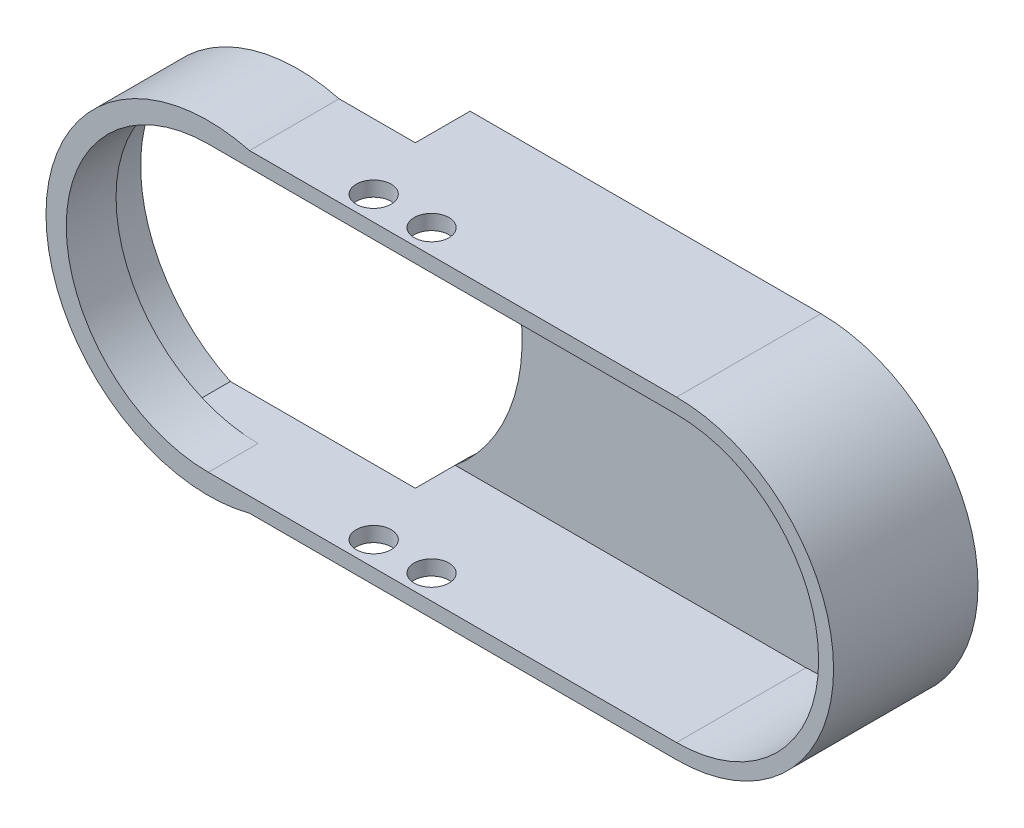
ISO-10303-21;
HEADER;
FILE_DESCRIPTION(('STEP AP214'),'2;1');
FILE_NAME('part.step','',(''),(''),'','','');
FILE_SCHEMA(('AUTOMOTIVE_DESIGN { 1 0 10303 214 1 1 1 1 }'));
ENDSEC;
DATA;
#1=APPLICATION_CONTEXT('core data for automotive mechanical design processes');
#2=APPLICATION_PROTOCOL_DEFINITION('international standard','automotive_design',2000,#1);
#3=PRODUCT_CONTEXT('',#1,'mechanical');
#4=PRODUCT('Part','Part','',(#3));
#5=PRODUCT_RELATED_PRODUCT_CATEGORY('part','',(#4));
#6=PRODUCT_DEFINITION_FORMATION('','',#4);
#7=PRODUCT_DEFINITION_CONTEXT('part definition',#1,'design');
#8=PRODUCT_DEFINITION('design','',#6,#7);
#9=PRODUCT_DEFINITION_SHAPE('','',#8);
#10=(LENGTH_UNIT() NAMED_UNIT(*) SI_UNIT(.MILLI.,.METRE.));
#11=(NAMED_UNIT(*) PLANE_ANGLE_UNIT() SI_UNIT($,.RADIAN.));
#12=(NAMED_UNIT(*) SI_UNIT($,.STERADIAN.) SOLID_ANGLE_UNIT());
#13=UNCERTAINTY_MEASURE_WITH_UNIT(LENGTH_MEASURE(1.E-05),#10,'distance_accuracy_value','');
#14=(GEOMETRIC_REPRESENTATION_CONTEXT(3) GLOBAL_UNCERTAINTY_ASSIGNED_CONTEXT((#13)) GLOBAL_UNIT_ASSIGNED_CONTEXT((#10,
#11,#12)) REPRESENTATION_CONTEXT('',''));
#15=CARTESIAN_POINT('',(0.,0.,0.));
#16=DIRECTION('',(0.,0.,1.));
#17=DIRECTION('',(1.,0.,0.));
#18=AXIS2_PLACEMENT_3D('',#15,#16,#17);
#19=CARTESIAN_POINT('',(-58.78,0.,19.));
#20=DIRECTION('',(0.,0.,-1.));
#21=DIRECTION('',(-1.,0.,0.));
#22=AXIS2_PLACEMENT_3D('',#19,#20,#21);
#23=PLANE('',#22);
#24=CARTESIAN_POINT('',(-58.78,0.,19.));
#25=DIRECTION('',(0.,0.,-1.));
#26=DIRECTION('',(-1.,0.,0.));
#27=AXIS2_PLACEMENT_3D('',#24,#25,#26);
#28=CIRCLE('',#27,28.535);
#29=CARTESIAN_POINT('',(-58.78,-28.535,19.));
#30=VERTEX_POINT('',#29);
#31=CARTESIAN_POINT('',(-58.78,28.535,19.));
#32=VERTEX_POINT('',#31);
#33=EDGE_CURVE('E297',#30,#32,#28,.T.);
#34=ORIENTED_EDGE('',*,*,#33,.F.);
#35=DIRECTION('',(1.,0.,0.));
#36=VECTOR('',#35,1.);
#37=CARTESIAN_POINT('',(-72.3562209395693,-28.535,19.));
#38=LINE('',#37,#36);
#39=CARTESIAN_POINT('',(-72.3562209395693,-28.535,19.));
#40=VERTEX_POINT('',#39);
#41=EDGE_CURVE('E284',#40,#30,#38,.T.);
#42=ORIENTED_EDGE('',*,*,#41,.F.);
#43=CARTESIAN_POINT('',(-58.78,0.,19.));
#44=DIRECTION('',(0.,0.,1.));
#45=DIRECTION('',(-1.,0.,0.));
#46=AXIS2_PLACEMENT_3D('',#43,#44,#45);
#47=CIRCLE('',#46,31.6);
#48=CARTESIAN_POINT('',(-72.3562209395693,28.535,19.));
#49=VERTEX_POINT('',#48);
#50=EDGE_CURVE('E288',#49,#40,#47,.T.);
#51=ORIENTED_EDGE('',*,*,#50,.F.);
#52=DIRECTION('',(1.,0.,0.));
#53=VECTOR('',#52,1.);
#54=CARTESIAN_POINT('',(-58.78,28.535,19.));
#55=LINE('',#54,#53);
#56=EDGE_CURVE('E11',#49,#32,#55,.T.);
#57=ORIENTED_EDGE('',*,*,#56,.T.);
#58=EDGE_LOOP('',(#34,#42,#51,#57));
#59=FACE_BOUND('',#58,.T.);
#60=ADVANCED_FACE('F34',(#59),#23,.T.);
#61=CARTESIAN_POINT('',(-58.7766070646208,0.,3.));
#62=DIRECTION('',(0.,0.,-1.));
#63=DIRECTION('',(-1.,0.,0.));
#64=AXIS2_PLACEMENT_3D('',#61,#62,#63);
#65=PLANE('',#64);
#66=DIRECTION('',(-1.,0.,0.));
#67=VECTOR('',#66,1.);
#68=CARTESIAN_POINT('',(-35.2233955001653,-28.535,3.));
#69=LINE('',#68,#67);
#70=CARTESIAN_POINT('',(35.2233955001653,-28.535,3.));
#71=VERTEX_POINT('',#70);
#72=CARTESIAN_POINT('',(-35.2233955001653,-28.535,3.));
#73=VERTEX_POINT('',#72);
#74=EDGE_CURVE('E49',#71,#73,#69,.T.);
#75=ORIENTED_EDGE('',*,*,#74,.F.);
#76=CARTESIAN_POINT('',(35.2233955001653,0.,3.));
#77=DIRECTION('',(0.,0.,-1.));
#78=DIRECTION('',(1.,0.,0.));
#79=AXIS2_PLACEMENT_3D('',#76,#77,#78);
#80=CIRCLE('',#79,28.535);
#81=CARTESIAN_POINT('',(35.2233955001653,28.535,3.));
#82=VERTEX_POINT('',#81);
#83=EDGE_CURVE('E170',#82,#71,#80,.T.);
#84=ORIENTED_EDGE('',*,*,#83,.F.);
#85=DIRECTION('',(1.,0.,0.));
#86=VECTOR('',#85,1.);
#87=CARTESIAN_POINT('',(-35.2233955001653,28.535,3.));
#88=LINE('',#87,#86);
#89=CARTESIAN_POINT('',(-35.2233955001653,28.535,3.));
#90=VERTEX_POINT('',#89);
#91=EDGE_CURVE('E140',#90,#82,#88,.T.);
#92=ORIENTED_EDGE('',*,*,#91,.F.);
#93=CARTESIAN_POINT('',(-58.7766070646208,0.,3.));
#94=DIRECTION('',(0.,0.,-1.));
#95=DIRECTION('',(-1.,0.,0.));
#96=AXIS2_PLACEMENT_3D('',#93,#94,#95);
#97=CIRCLE('',#96,37.);
#98=EDGE_CURVE('E96',#90,#73,#97,.T.);
#99=ORIENTED_EDGE('',*,*,#98,.T.);
#100=EDGE_LOOP('',(#75,#84,#92,#99));
#101=FACE_BOUND('',#100,.T.);
#102=ADVANCED_FACE('F334',(#101),#65,.F.);
#103=CARTESIAN_POINT('',(-58.7766070646208,0.,3.));
#104=DIRECTION('',(0.,0.,-1.));
#105=DIRECTION('',(-1.,0.,0.));
#106=AXIS2_PLACEMENT_3D('',#103,#104,#105);
#107=CYLINDRICAL_SURFACE('',#106,37.);
#108=CARTESIAN_POINT('',(-58.7766070646208,0.,0.));
#109=DIRECTION('',(0.,0.,-1.));
#110=DIRECTION('',(-1.,0.,0.));
#111=AXIS2_PLACEMENT_3D('',#108,#109,#110);
#112=CIRCLE('',#111,37.);
#113=CARTESIAN_POINT('',(-35.2233955001653,28.535,0.));
#114=VERTEX_POINT('',#113);
#115=CARTESIAN_POINT('',(-35.2233955001653,-28.535,0.));
#116=VERTEX_POINT('',#115);
#117=EDGE_CURVE('E102',#114,#116,#112,.T.);
#118=ORIENTED_EDGE('',*,*,#117,.T.);
#119=DIRECTION('',(0.,0.,-1.));
#120=VECTOR('',#119,1.);
#121=CARTESIAN_POINT('',(-35.2233955001653,-28.535,3.));
#122=LINE('',#121,#120);
#123=EDGE_CURVE('E42',#73,#116,#122,.T.);
#124=ORIENTED_EDGE('',*,*,#123,.F.);
#125=ORIENTED_EDGE('',*,*,#98,.F.);
#126=DIRECTION('',(0.,0.,-1.));
#127=VECTOR('',#126,1.);
#128=CARTESIAN_POINT('',(-35.2233955001653,28.535,3.));
#129=LINE('',#128,#127);
#130=EDGE_CURVE('E87',#90,#114,#129,.T.);
#131=ORIENTED_EDGE('',*,*,#130,.T.);
#132=EDGE_LOOP('',(#118,#124,#125,#131));
#133=FACE_BOUND('',#132,.T.);
#134=ADVANCED_FACE('F36',(#133),#107,.F.);
#135=CARTESIAN_POINT('',(-35.2233955001653,-28.535,3.));
#136=DIRECTION('',(1.,0.,0.));
#137=DIRECTION('',(0.,0.,-1.));
#138=AXIS2_PLACEMENT_3D('',#135,#136,#137);
#139=PLANE('',#138);
#140=DIRECTION('',(0.,0.,-1.));
#141=VECTOR('',#140,1.);
#142=CARTESIAN_POINT('',(-35.2233955001653,-31.535,3.));
#143=LINE('',#142,#141);
#144=CARTESIAN_POINT('',(-35.2233955001653,-31.535,11.));
#145=VERTEX_POINT('',#144);
#146=CARTESIAN_POINT('',(-35.2233955001653,-31.535,0.));
#147=VERTEX_POINT('',#146);
#148=EDGE_CURVE('E127',#145,#147,#143,.T.);
#149=ORIENTED_EDGE('',*,*,#148,.F.);
#150=DIRECTION('',(0.,-1.,0.));
#151=VECTOR('',#150,1.);
#152=CARTESIAN_POINT('',(-35.2233955001653,-31.535,11.));
#153=LINE('',#152,#151);
#154=CARTESIAN_POINT('',(-35.2233955001653,-28.535,11.));
#155=VERTEX_POINT('',#154);
#156=EDGE_CURVE('E275',#155,#145,#153,.T.);
#157=ORIENTED_EDGE('',*,*,#156,.F.);
#158=DIRECTION('',(0.,0.,-1.));
#159=VECTOR('',#158,1.);
#160=CARTESIAN_POINT('',(-35.2233955001653,-28.535,29.));
#161=LINE('',#160,#159);
#162=EDGE_CURVE('E168',#155,#73,#161,.T.);
#163=ORIENTED_EDGE('',*,*,#162,.T.);
#164=ORIENTED_EDGE('',*,*,#123,.T.);
#165=DIRECTION('',(0.,-1.,0.));
#166=VECTOR('',#165,1.);
#167=CARTESIAN_POINT('',(-35.2233955001653,-28.535,0.));
#168=LINE('',#167,#166);
#169=EDGE_CURVE('E107',#116,#147,#168,.T.);
#170=ORIENTED_EDGE('',*,*,#169,.T.);
#171=EDGE_LOOP('',(#149,#157,#163,#164,#170));
#172=FACE_BOUND('',#171,.T.);
#173=ADVANCED_FACE('F421',(#172),#139,.F.);
#174=CARTESIAN_POINT('',(-35.2233955001653,-31.535,3.));
#175=DIRECTION('',(0.,1.,0.));
#176=DIRECTION('',(0.,0.,1.));
#177=AXIS2_PLACEMENT_3D('',#174,#175,#176);
#178=PLANE('',#177);
#179=DIRECTION('',(-1.,0.,0.));
#180=VECTOR('',#179,1.);
#181=CARTESIAN_POINT('',(-50.5153902088484,-31.535,11.));
#182=LINE('',#181,#180);
#183=CARTESIAN_POINT('',(-50.5153902088484,-31.535,11.));
#184=VERTEX_POINT('',#183);
#185=EDGE_CURVE('E549',#145,#184,#182,.T.);
#186=ORIENTED_EDGE('',*,*,#185,.F.);
#187=ORIENTED_EDGE('',*,*,#148,.T.);
#188=DIRECTION('',(1.,0.,0.));
#189=VECTOR('',#188,1.);
#190=CARTESIAN_POINT('',(-35.2233955001653,-31.535,0.));
#191=LINE('',#190,#189);
#192=CARTESIAN_POINT('',(35.2233955001653,-31.535,0.));
#193=VERTEX_POINT('',#192);
#194=EDGE_CURVE('E110',#147,#193,#191,.T.);
#195=ORIENTED_EDGE('',*,*,#194,.T.);
#196=DIRECTION('',(0.,0.,-1.));
#197=VECTOR('',#196,1.);
#198=CARTESIAN_POINT('',(35.2233955001653,-31.535,3.));
#199=LINE('',#198,#197);
#200=CARTESIAN_POINT('',(35.2233955001653,-31.535,29.));
#201=VERTEX_POINT('',#200);
#202=EDGE_CURVE('E124',#201,#193,#199,.T.);
#203=ORIENTED_EDGE('',*,*,#202,.F.);
#204=DIRECTION('',(1.,0.,0.));
#205=VECTOR('',#204,1.);
#206=CARTESIAN_POINT('',(35.2233955001653,-31.535,29.));
#207=LINE('',#206,#205);
#208=CARTESIAN_POINT('',(-50.5153902088484,-31.535,29.));
#209=VERTEX_POINT('',#208);
#210=EDGE_CURVE('E165',#209,#201,#207,.T.);
#211=ORIENTED_EDGE('',*,*,#210,.F.);
#212=DIRECTION('',(0.,0.,1.));
#213=VECTOR('',#212,1.);
#214=CARTESIAN_POINT('',(-50.5153902088484,-31.535,19.));
#215=LINE('',#214,#213);
#216=EDGE_CURVE('E299',#184,#209,#215,.T.);
#217=ORIENTED_EDGE('',*,*,#216,.F.);
#218=EDGE_LOOP('',(#186,#187,#195,#203,#211,#217));
#219=FACE_BOUND('',#218,.T.);
#220=CARTESIAN_POINT('',(-18.8433955001653,-31.5350000000001,24.12));
#221=DIRECTION('',(0.,1.,0.));
#222=DIRECTION('',(0.,0.,1.));
#223=AXIS2_PLACEMENT_3D('',#220,#221,#222);
#224=CIRCLE('',#223,3.5);
#225=CARTESIAN_POINT('',(-18.8433955001653,-31.5350000000001,27.62));
#226=VERTEX_POINT('',#225);
#227=EDGE_CURVE('E133',#226,#226,#224,.T.);
#228=ORIENTED_EDGE('',*,*,#227,.T.);
#229=EDGE_LOOP('',(#228));
#230=FACE_BOUND('',#229,.T.);
#231=CARTESIAN_POINT('',(-30.4633955001653,-31.5350000000001,24.12));
#232=DIRECTION('',(0.,1.,0.));
#233=DIRECTION('',(0.,0.,1.));
#234=AXIS2_PLACEMENT_3D('',#231,#232,#233);
#235=CIRCLE('',#234,3.5);
#236=CARTESIAN_POINT('',(-30.4633955001653,-31.5350000000001,27.62));
#237=VERTEX_POINT('',#236);
#238=EDGE_CURVE('E313',#237,#237,#235,.T.);
#239=ORIENTED_EDGE('',*,*,#238,.T.);
#240=EDGE_LOOP('',(#239));
#241=FACE_BOUND('',#240,.T.);
#242=ADVANCED_FACE('F206',(#219,#230,#241),#178,.F.);
#243=CARTESIAN_POINT('',(35.2233929353792,0.,3.));
#244=DIRECTION('',(0.,0.,-1.));
#245=DIRECTION('',(-1.,0.,0.));
#246=AXIS2_PLACEMENT_3D('',#243,#244,#245);
#247=CYLINDRICAL_SURFACE('',#246,31.5350000000001);
#248=CARTESIAN_POINT('',(35.2233929353792,0.,0.));
#249=DIRECTION('',(0.,0.,1.));
#250=DIRECTION('',(1.,0.,0.));
#251=AXIS2_PLACEMENT_3D('',#248,#249,#250);
#252=CIRCLE('',#251,31.5350000000001);
#253=CARTESIAN_POINT('',(35.2233955001653,31.535,0.));
#254=VERTEX_POINT('',#253);
#255=EDGE_CURVE('E117',#193,#254,#252,.T.);
#256=ORIENTED_EDGE('',*,*,#255,.T.);
#257=DIRECTION('',(0.,0.,-1.));
#258=VECTOR('',#257,1.);
#259=CARTESIAN_POINT('',(35.2233955001653,31.535,3.));
#260=LINE('',#259,#258);
#261=CARTESIAN_POINT('',(35.2233955001653,31.535,29.));
#262=VERTEX_POINT('',#261);
#263=EDGE_CURVE('E121',#262,#254,#260,.T.);
#264=ORIENTED_EDGE('',*,*,#263,.F.);
#265=CARTESIAN_POINT('',(35.2233955001653,0.,29.));
#266=DIRECTION('',(0.,0.,1.));
#267=DIRECTION('',(1.,0.,0.));
#268=AXIS2_PLACEMENT_3D('',#265,#266,#267);
#269=CIRCLE('',#268,31.535);
#270=EDGE_CURVE('E150',#201,#262,#269,.T.);
#271=ORIENTED_EDGE('',*,*,#270,.F.);
#272=ORIENTED_EDGE('',*,*,#202,.T.);
#273=EDGE_LOOP('',(#256,#264,#271,#272));
#274=FACE_BOUND('',#273,.T.);
#275=ADVANCED_FACE('F219',(#274),#247,.T.);
#276=CARTESIAN_POINT('',(-35.2233955001653,31.535,3.));
#277=DIRECTION('',(0.,-1.,0.));
#278=DIRECTION('',(0.,0.,-1.));
#279=AXIS2_PLACEMENT_3D('',#276,#277,#278);
#280=PLANE('',#279);
#281=DIRECTION('',(0.,0.,-1.));
#282=VECTOR('',#281,1.);
#283=CARTESIAN_POINT('',(-35.2233955001653,31.535,3.));
#284=LINE('',#283,#282);
#285=CARTESIAN_POINT('',(-35.2233955001653,31.535,11.));
#286=VERTEX_POINT('',#285);
#287=CARTESIAN_POINT('',(-35.2233955001653,31.535,0.));
#288=VERTEX_POINT('',#287);
#289=EDGE_CURVE('E91',#286,#288,#284,.T.);
#290=ORIENTED_EDGE('',*,*,#289,.F.);
#291=DIRECTION('',(1.,0.,0.));
#292=VECTOR('',#291,1.);
#293=CARTESIAN_POINT('',(-50.5153902088484,31.535,11.));
#294=LINE('',#293,#292);
#295=CARTESIAN_POINT('',(-50.5153902088483,31.535,11.));
#296=VERTEX_POINT('',#295);
#297=EDGE_CURVE('E554',#296,#286,#294,.T.);
#298=ORIENTED_EDGE('',*,*,#297,.F.);
#299=DIRECTION('',(0.,0.,1.));
#300=VECTOR('',#299,1.);
#301=CARTESIAN_POINT('',(-50.5153902088484,31.535,19.));
#302=LINE('',#301,#300);
#303=CARTESIAN_POINT('',(-50.5153902088484,31.535,29.));
#304=VERTEX_POINT('',#303);
#305=EDGE_CURVE('E227',#296,#304,#302,.T.);
#306=ORIENTED_EDGE('',*,*,#305,.T.);
#307=DIRECTION('',(-1.,0.,0.));
#308=VECTOR('',#307,1.);
#309=CARTESIAN_POINT('',(35.2233955001653,31.535,29.));
#310=LINE('',#309,#308);
#311=EDGE_CURVE('E153',#262,#304,#310,.T.);
#312=ORIENTED_EDGE('',*,*,#311,.F.);
#313=ORIENTED_EDGE('',*,*,#263,.T.);
#314=DIRECTION('',(-1.,0.,0.));
#315=VECTOR('',#314,1.);
#316=CARTESIAN_POINT('',(-35.2233955001653,31.535,0.));
#317=LINE('',#316,#315);
#318=EDGE_CURVE('E97',#254,#288,#317,.T.);
#319=ORIENTED_EDGE('',*,*,#318,.T.);
#320=EDGE_LOOP('',(#290,#298,#306,#312,#313,#319));
#321=FACE_BOUND('',#320,.T.);
#322=CARTESIAN_POINT('',(-18.8433955001653,31.535,24.12));
#323=DIRECTION('',(0.,1.,0.));
#324=DIRECTION('',(0.,0.,1.));
#325=AXIS2_PLACEMENT_3D('',#322,#323,#324);
#326=CIRCLE('',#325,3.5);
#327=CARTESIAN_POINT('',(-18.8433955001653,31.535,27.62));
#328=VERTEX_POINT('',#327);
#329=EDGE_CURVE('E311',#328,#328,#326,.T.);
#330=ORIENTED_EDGE('',*,*,#329,.F.);
#331=EDGE_LOOP('',(#330));
#332=FACE_BOUND('',#331,.T.);
#333=CARTESIAN_POINT('',(-30.4633955001653,31.535,24.12));
#334=DIRECTION('',(0.,1.,0.));
#335=DIRECTION('',(0.,0.,1.));
#336=AXIS2_PLACEMENT_3D('',#333,#334,#335);
#337=CIRCLE('',#336,3.5);
#338=CARTESIAN_POINT('',(-30.4633955001653,31.535,27.62));
#339=VERTEX_POINT('',#338);
#340=EDGE_CURVE('E147',#339,#339,#337,.T.);
#341=ORIENTED_EDGE('',*,*,#340,.F.);
#342=EDGE_LOOP('',(#341));
#343=FACE_BOUND('',#342,.T.);
#344=ADVANCED_FACE('F223',(#321,#332,#343),#280,.F.);
#345=CARTESIAN_POINT('',(-35.2233955001653,28.535,3.));
#346=DIRECTION('',(1.,0.,0.));
#347=DIRECTION('',(0.,0.,-1.));
#348=AXIS2_PLACEMENT_3D('',#345,#346,#347);
#349=PLANE('',#348);
#350=DIRECTION('',(0.,0.,-1.));
#351=VECTOR('',#350,1.);
#352=CARTESIAN_POINT('',(-35.2233955001653,28.535,29.));
#353=LINE('',#352,#351);
#354=CARTESIAN_POINT('',(-35.2233955001653,28.535,11.));
#355=VERTEX_POINT('',#354);
#356=EDGE_CURVE('E58',#355,#90,#353,.T.);
#357=ORIENTED_EDGE('',*,*,#356,.F.);
#358=DIRECTION('',(0.,-1.,0.));
#359=VECTOR('',#358,1.);
#360=CARTESIAN_POINT('',(-35.2233955001653,31.535,11.));
#361=LINE('',#360,#359);
#362=EDGE_CURVE('E559',#286,#355,#361,.T.);
#363=ORIENTED_EDGE('',*,*,#362,.F.);
#364=ORIENTED_EDGE('',*,*,#289,.T.);
#365=DIRECTION('',(0.,-1.,0.));
#366=VECTOR('',#365,1.);
#367=CARTESIAN_POINT('',(-35.2233955001653,28.535,0.));
#368=LINE('',#367,#366);
#369=EDGE_CURVE('E84',#288,#114,#368,.T.);
#370=ORIENTED_EDGE('',*,*,#369,.T.);
#371=ORIENTED_EDGE('',*,*,#130,.F.);
#372=EDGE_LOOP('',(#357,#363,#364,#370,#371));
#373=FACE_BOUND('',#372,.T.);
#374=ADVANCED_FACE('F86',(#373),#349,.F.);
#375=CARTESIAN_POINT('',(-58.7766070646208,0.,0.));
#376=DIRECTION('',(0.,0.,-1.));
#377=DIRECTION('',(-1.,0.,0.));
#378=AXIS2_PLACEMENT_3D('',#375,#376,#377);
#379=PLANE('',#378);
#380=ORIENTED_EDGE('',*,*,#117,.F.);
#381=ORIENTED_EDGE('',*,*,#369,.F.);
#382=ORIENTED_EDGE('',*,*,#318,.F.);
#383=ORIENTED_EDGE('',*,*,#255,.F.);
#384=ORIENTED_EDGE('',*,*,#194,.F.);
#385=ORIENTED_EDGE('',*,*,#169,.F.);
#386=EDGE_LOOP('',(#380,#381,#382,#383,#384,#385));
#387=FACE_BOUND('',#386,.T.);
#388=ADVANCED_FACE('F104',(#387),#379,.T.);
#389=CARTESIAN_POINT('',(-35.2233955001653,28.535,29.));
#390=DIRECTION('',(0.,1.,0.));
#391=DIRECTION('',(-1.,0.,0.));
#392=AXIS2_PLACEMENT_3D('',#389,#390,#391);
#393=PLANE('',#392);
#394=DIRECTION('',(-1.,0.,0.));
#395=VECTOR('',#394,1.);
#396=CARTESIAN_POINT('',(-72.3562209395693,28.535,11.));
#397=LINE('',#396,#395);
#398=CARTESIAN_POINT('',(-72.3562209395693,28.535,11.));
#399=VERTEX_POINT('',#398);
#400=EDGE_CURVE('E280',#355,#399,#397,.T.);
#401=ORIENTED_EDGE('',*,*,#400,.F.);
#402=ORIENTED_EDGE('',*,*,#356,.T.);
#403=ORIENTED_EDGE('',*,*,#91,.T.);
#404=DIRECTION('',(0.,0.,-1.));
#405=VECTOR('',#404,1.);
#406=CARTESIAN_POINT('',(35.2233955001653,28.535,29.));
#407=LINE('',#406,#405);
#408=CARTESIAN_POINT('',(35.2233955001653,28.535,29.));
#409=VERTEX_POINT('',#408);
#410=EDGE_CURVE('E112',#409,#82,#407,.T.);
#411=ORIENTED_EDGE('',*,*,#410,.F.);
#412=DIRECTION('',(1.,0.,0.));
#413=VECTOR('',#412,1.);
#414=CARTESIAN_POINT('',(-35.2233955001653,28.535,29.));
#415=LINE('',#414,#413);
#416=CARTESIAN_POINT('',(-58.78,28.535,29.));
#417=VERTEX_POINT('',#416);
#418=EDGE_CURVE('E156',#417,#409,#415,.T.);
#419=ORIENTED_EDGE('',*,*,#418,.F.);
#420=DIRECTION('',(0.,0.,1.));
#421=VECTOR('',#420,1.);
#422=CARTESIAN_POINT('',(-58.78,28.535,19.));
#423=LINE('',#422,#421);
#424=EDGE_CURVE('E303',#32,#417,#423,.T.);
#425=ORIENTED_EDGE('',*,*,#424,.F.);
#426=ORIENTED_EDGE('',*,*,#56,.F.);
#427=DIRECTION('',(0.,0.,1.));
#428=VECTOR('',#427,1.);
#429=CARTESIAN_POINT('',(-72.3562209395693,28.535,11.));
#430=LINE('',#429,#428);
#431=EDGE_CURVE('E290',#399,#49,#430,.T.);
#432=ORIENTED_EDGE('',*,*,#431,.F.);
#433=EDGE_LOOP('',(#401,#402,#403,#411,#419,#425,#426,#432));
#434=FACE_BOUND('',#433,.T.);
#435=CARTESIAN_POINT('',(-18.8433955001653,28.535,24.12));
#436=DIRECTION('',(0.,1.,0.));
#437=DIRECTION('',(-1.,0.,0.));
#438=AXIS2_PLACEMENT_3D('',#435,#436,#437);
#439=CIRCLE('',#438,3.5);
#440=CARTESIAN_POINT('',(-22.3433955001653,28.535,24.12));
#441=VERTEX_POINT('',#440);
#442=EDGE_CURVE('E136',#441,#441,#439,.T.);
#443=ORIENTED_EDGE('',*,*,#442,.T.);
#444=EDGE_LOOP('',(#443));
#445=FACE_BOUND('',#444,.T.);
#446=CARTESIAN_POINT('',(-30.4633955001653,28.535,24.12));
#447=DIRECTION('',(0.,1.,0.));
#448=DIRECTION('',(-1.,0.,0.));
#449=AXIS2_PLACEMENT_3D('',#446,#447,#448);
#450=CIRCLE('',#449,3.5);
#451=CARTESIAN_POINT('',(-33.9633955001653,28.535,24.12));
#452=VERTEX_POINT('',#451);
#453=EDGE_CURVE('E132',#452,#452,#450,.T.);
#454=ORIENTED_EDGE('',*,*,#453,.T.);
#455=EDGE_LOOP('',(#454));
#456=FACE_BOUND('',#455,.T.);
#457=ADVANCED_FACE('F188',(#434,#445,#456),#393,.F.);
#458=CARTESIAN_POINT('',(35.2233955001653,0.,29.));
#459=DIRECTION('',(0.,0.,-1.));
#460=DIRECTION('',(-1.,0.,0.));
#461=AXIS2_PLACEMENT_3D('',#458,#459,#460);
#462=CYLINDRICAL_SURFACE('',#461,28.535);
#463=ORIENTED_EDGE('',*,*,#83,.T.);
#464=DIRECTION('',(0.,0.,-1.));
#465=VECTOR('',#464,1.);
#466=CARTESIAN_POINT('',(35.2233955001653,-28.535,29.));
#467=LINE('',#466,#465);
#468=CARTESIAN_POINT('',(35.2233955001653,-28.535,29.));
#469=VERTEX_POINT('',#468);
#470=EDGE_CURVE('E174',#469,#71,#467,.T.);
#471=ORIENTED_EDGE('',*,*,#470,.F.);
#472=CARTESIAN_POINT('',(35.2233955001653,0.,29.));
#473=DIRECTION('',(0.,0.,-1.));
#474=DIRECTION('',(1.,0.,0.));
#475=AXIS2_PLACEMENT_3D('',#472,#473,#474);
#476=CIRCLE('',#475,28.535);
#477=EDGE_CURVE('E159',#409,#469,#476,.T.);
#478=ORIENTED_EDGE('',*,*,#477,.F.);
#479=ORIENTED_EDGE('',*,*,#410,.T.);
#480=EDGE_LOOP('',(#463,#471,#478,#479));
#481=FACE_BOUND('',#480,.T.);
#482=ADVANCED_FACE('F182',(#481),#462,.F.);
#483=CARTESIAN_POINT('',(-35.2233955001653,-28.535,29.));
#484=DIRECTION('',(0.,-1.,0.));
#485=DIRECTION('',(0.,0.,-1.));
#486=AXIS2_PLACEMENT_3D('',#483,#484,#485);
#487=PLANE('',#486);
#488=ORIENTED_EDGE('',*,*,#162,.F.);
#489=DIRECTION('',(1.,0.,0.));
#490=VECTOR('',#489,1.);
#491=CARTESIAN_POINT('',(-72.3562209395693,-28.535,11.));
#492=LINE('',#491,#490);
#493=CARTESIAN_POINT('',(-72.3562209395693,-28.535,11.));
#494=VERTEX_POINT('',#493);
#495=EDGE_CURVE('E267',#494,#155,#492,.T.);
#496=ORIENTED_EDGE('',*,*,#495,.F.);
#497=DIRECTION('',(0.,0.,1.));
#498=VECTOR('',#497,1.);
#499=CARTESIAN_POINT('',(-72.3562209395693,-28.535,11.));
#500=LINE('',#499,#498);
#501=EDGE_CURVE('E271',#494,#40,#500,.T.);
#502=ORIENTED_EDGE('',*,*,#501,.T.);
#503=ORIENTED_EDGE('',*,*,#41,.T.);
#504=DIRECTION('',(0.,0.,1.));
#505=VECTOR('',#504,1.);
#506=CARTESIAN_POINT('',(-58.78,-28.535,19.));
#507=LINE('',#506,#505);
#508=CARTESIAN_POINT('',(-58.78,-28.535,29.));
#509=VERTEX_POINT('',#508);
#510=EDGE_CURVE('E305',#30,#509,#507,.T.);
#511=ORIENTED_EDGE('',*,*,#510,.T.);
#512=DIRECTION('',(-1.,0.,0.));
#513=VECTOR('',#512,1.);
#514=CARTESIAN_POINT('',(-35.2233955001653,-28.535,29.));
#515=LINE('',#514,#513);
#516=EDGE_CURVE('E162',#469,#509,#515,.T.);
#517=ORIENTED_EDGE('',*,*,#516,.F.);
#518=ORIENTED_EDGE('',*,*,#470,.T.);
#519=ORIENTED_EDGE('',*,*,#74,.T.);
#520=EDGE_LOOP('',(#488,#496,#502,#503,#511,#517,#518,#519));
#521=FACE_BOUND('',#520,.T.);
#522=CARTESIAN_POINT('',(-18.8433955001653,-28.535,24.12));
#523=DIRECTION('',(0.,-1.,0.));
#524=DIRECTION('',(0.,0.,-1.));
#525=AXIS2_PLACEMENT_3D('',#522,#523,#524);
#526=CIRCLE('',#525,3.5);
#527=CARTESIAN_POINT('',(-18.8433955001653,-28.535,20.62));
#528=VERTEX_POINT('',#527);
#529=EDGE_CURVE('E134',#528,#528,#526,.T.);
#530=ORIENTED_EDGE('',*,*,#529,.T.);
#531=EDGE_LOOP('',(#530));
#532=FACE_BOUND('',#531,.T.);
#533=CARTESIAN_POINT('',(-30.4633955001653,-28.535,24.12));
#534=DIRECTION('',(0.,-1.,0.));
#535=DIRECTION('',(0.,0.,-1.));
#536=AXIS2_PLACEMENT_3D('',#533,#534,#535);
#537=CIRCLE('',#536,3.5);
#538=CARTESIAN_POINT('',(-30.4633955001653,-28.535,20.62));
#539=VERTEX_POINT('',#538);
#540=EDGE_CURVE('E130',#539,#539,#537,.T.);
#541=ORIENTED_EDGE('',*,*,#540,.T.);
#542=EDGE_LOOP('',(#541));
#543=FACE_BOUND('',#542,.T.);
#544=ADVANCED_FACE('F269',(#521,#532,#543),#487,.F.);
#545=CARTESIAN_POINT('',(35.2233955001653,0.,29.));
#546=DIRECTION('',(0.,0.,1.));
#547=DIRECTION('',(1.,0.,0.));
#548=AXIS2_PLACEMENT_3D('',#545,#546,#547);
#549=PLANE('',#548);
#550=CARTESIAN_POINT('',(-58.78,0.,29.));
#551=DIRECTION('',(0.,0.,-1.));
#552=DIRECTION('',(-1.,0.,0.));
#553=AXIS2_PLACEMENT_3D('',#550,#551,#552);
#554=CIRCLE('',#553,28.535);
#555=EDGE_CURVE('E292',#509,#417,#554,.T.);
#556=ORIENTED_EDGE('',*,*,#555,.T.);
#557=ORIENTED_EDGE('',*,*,#418,.T.);
#558=ORIENTED_EDGE('',*,*,#477,.T.);
#559=ORIENTED_EDGE('',*,*,#516,.T.);
#560=EDGE_LOOP('',(#556,#557,#558,#559));
#561=FACE_BOUND('',#560,.T.);
#562=ORIENTED_EDGE('',*,*,#270,.T.);
#563=ORIENTED_EDGE('',*,*,#311,.T.);
#564=CARTESIAN_POINT('',(-58.78,0.,29.));
#565=DIRECTION('',(0.,0.,1.));
#566=DIRECTION('',(-1.,0.,0.));
#567=AXIS2_PLACEMENT_3D('',#564,#565,#566);
#568=CIRCLE('',#567,32.6);
#569=EDGE_CURVE('E218',#304,#209,#568,.T.);
#570=ORIENTED_EDGE('',*,*,#569,.T.);
#571=ORIENTED_EDGE('',*,*,#210,.T.);
#572=EDGE_LOOP('',(#562,#563,#570,#571));
#573=FACE_BOUND('',#572,.T.);
#574=ADVANCED_FACE('F216',(#561,#573),#549,.T.);
#575=CARTESIAN_POINT('',(-30.4633955001653,-31.5350000000001,24.12));
#576=DIRECTION('',(0.,1.,0.));
#577=DIRECTION('',(0.,0.,1.));
#578=AXIS2_PLACEMENT_3D('',#575,#576,#577);
#579=CYLINDRICAL_SURFACE('',#578,3.5);
#580=ORIENTED_EDGE('',*,*,#238,.F.);
#581=EDGE_LOOP('',(#580));
#582=FACE_BOUND('',#581,.T.);
#583=ORIENTED_EDGE('',*,*,#540,.F.);
#584=EDGE_LOOP('',(#583));
#585=FACE_BOUND('',#584,.T.);
#586=ADVANCED_FACE('F360',(#582,#585),#579,.F.);
#587=CARTESIAN_POINT('',(-18.8433955001653,-31.5350000000001,24.12));
#588=DIRECTION('',(0.,1.,0.));
#589=DIRECTION('',(0.,0.,1.));
#590=AXIS2_PLACEMENT_3D('',#587,#588,#589);
#591=CYLINDRICAL_SURFACE('',#590,3.5);
#592=ORIENTED_EDGE('',*,*,#227,.F.);
#593=EDGE_LOOP('',(#592));
#594=FACE_BOUND('',#593,.T.);
#595=ORIENTED_EDGE('',*,*,#529,.F.);
#596=EDGE_LOOP('',(#595));
#597=FACE_BOUND('',#596,.T.);
#598=ADVANCED_FACE('F357',(#594,#597),#591,.F.);
#599=ORIENTED_EDGE('',*,*,#340,.T.);
#600=EDGE_LOOP('',(#599));
#601=FACE_BOUND('',#600,.T.);
#602=ORIENTED_EDGE('',*,*,#453,.F.);
#603=EDGE_LOOP('',(#602));
#604=FACE_BOUND('',#603,.T.);
#605=ADVANCED_FACE('F320',(#601,#604),#579,.F.);
#606=ORIENTED_EDGE('',*,*,#329,.T.);
#607=EDGE_LOOP('',(#606));
#608=FACE_BOUND('',#607,.T.);
#609=ORIENTED_EDGE('',*,*,#442,.F.);
#610=EDGE_LOOP('',(#609));
#611=FACE_BOUND('',#610,.T.);
#612=ADVANCED_FACE('F353',(#608,#611),#591,.F.);
#613=CARTESIAN_POINT('',(-58.78,0.,19.));
#614=DIRECTION('',(0.,0.,1.));
#615=DIRECTION('',(1.,0.,0.));
#616=AXIS2_PLACEMENT_3D('',#613,#614,#615);
#617=CYLINDRICAL_SURFACE('',#616,32.6);
#618=ORIENTED_EDGE('',*,*,#569,.F.);
#619=ORIENTED_EDGE('',*,*,#305,.F.);
#620=CARTESIAN_POINT('',(-58.78,0.,11.));
#621=DIRECTION('',(0.,0.,-1.));
#622=DIRECTION('',(-1.,0.,0.));
#623=AXIS2_PLACEMENT_3D('',#620,#621,#622);
#624=CIRCLE('',#623,32.6);
#625=EDGE_CURVE('E552',#184,#296,#624,.T.);
#626=ORIENTED_EDGE('',*,*,#625,.F.);
#627=ORIENTED_EDGE('',*,*,#216,.T.);
#628=EDGE_LOOP('',(#618,#619,#626,#627));
#629=FACE_BOUND('',#628,.T.);
#630=ADVANCED_FACE('F349',(#629),#617,.T.);
#631=CARTESIAN_POINT('',(-58.78,0.,19.));
#632=DIRECTION('',(0.,0.,1.));
#633=DIRECTION('',(1.,0.,0.));
#634=AXIS2_PLACEMENT_3D('',#631,#632,#633);
#635=CYLINDRICAL_SURFACE('',#634,28.535);
#636=ORIENTED_EDGE('',*,*,#555,.F.);
#637=ORIENTED_EDGE('',*,*,#510,.F.);
#638=ORIENTED_EDGE('',*,*,#33,.T.);
#639=ORIENTED_EDGE('',*,*,#424,.T.);
#640=EDGE_LOOP('',(#636,#637,#638,#639));
#641=FACE_BOUND('',#640,.T.);
#642=ADVANCED_FACE('F346',(#641),#635,.F.);
#643=CARTESIAN_POINT('',(-58.78,0.,11.));
#644=DIRECTION('',(0.,0.,1.));
#645=DIRECTION('',(1.,0.,0.));
#646=AXIS2_PLACEMENT_3D('',#643,#644,#645);
#647=CYLINDRICAL_SURFACE('',#646,31.6);
#648=ORIENTED_EDGE('',*,*,#50,.T.);
#649=ORIENTED_EDGE('',*,*,#501,.F.);
#650=CARTESIAN_POINT('',(-58.78,0.,11.));
#651=DIRECTION('',(0.,0.,1.));
#652=DIRECTION('',(-1.,0.,0.));
#653=AXIS2_PLACEMENT_3D('',#650,#651,#652);
#654=CIRCLE('',#653,31.6);
#655=EDGE_CURVE('E276',#399,#494,#654,.T.);
#656=ORIENTED_EDGE('',*,*,#655,.F.);
#657=ORIENTED_EDGE('',*,*,#431,.T.);
#658=EDGE_LOOP('',(#648,#649,#656,#657));
#659=FACE_BOUND('',#658,.T.);
#660=ADVANCED_FACE('F286',(#659),#647,.F.);
#661=CARTESIAN_POINT('',(-58.78,0.,11.));
#662=DIRECTION('',(0.,0.,-1.));
#663=DIRECTION('',(-1.,0.,0.));
#664=AXIS2_PLACEMENT_3D('',#661,#662,#663);
#665=PLANE('',#664);
#666=ORIENTED_EDGE('',*,*,#655,.T.);
#667=ORIENTED_EDGE('',*,*,#495,.T.);
#668=ORIENTED_EDGE('',*,*,#156,.T.);
#669=ORIENTED_EDGE('',*,*,#185,.T.);
#670=ORIENTED_EDGE('',*,*,#625,.T.);
#671=ORIENTED_EDGE('',*,*,#297,.T.);
#672=ORIENTED_EDGE('',*,*,#362,.T.);
#673=ORIENTED_EDGE('',*,*,#400,.T.);
#674=EDGE_LOOP('',(#666,#667,#668,#669,#670,#671,#672,#673));
#675=FACE_BOUND('',#674,.T.);
#676=ADVANCED_FACE('F279',(#675),#665,.T.);
#677=CLOSED_SHELL('',(#60,#102,#134,#173,#242,#275,#344,#374,#388,#457,#482,#544,#574,#586,#598,
#605,#612,#630,#642,#660,#676));
#678=MANIFOLD_SOLID_BREP('B2',#677);
#679=ADVANCED_BREP_SHAPE_REPRESENTATION('',(#18,#678),#14);
#680=SHAPE_DEFINITION_REPRESENTATION(#9,#679);
ENDSEC;
END-ISO-10303-21;
